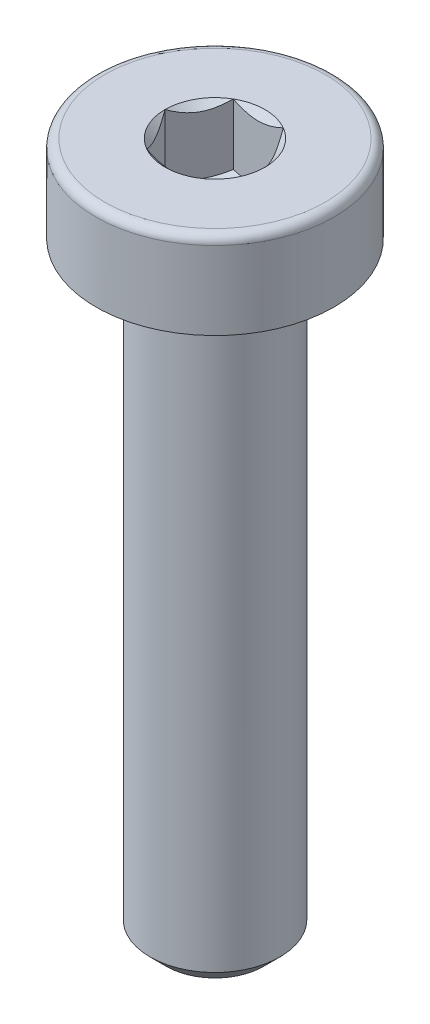
ISO-10303-21;
HEADER;
FILE_DESCRIPTION(('STEP AP214'),'2;1');
FILE_NAME('part.step','',(''),(''),'','','');
FILE_SCHEMA(('AUTOMOTIVE_DESIGN { 1 0 10303 214 1 1 1 1 }'));
ENDSEC;
DATA;
#1=APPLICATION_CONTEXT('core data for automotive mechanical design processes');
#2=APPLICATION_PROTOCOL_DEFINITION('international standard','automotive_design',2000,#1);
#3=PRODUCT_CONTEXT('',#1,'mechanical');
#4=PRODUCT('Part','Part','',(#3));
#5=PRODUCT_RELATED_PRODUCT_CATEGORY('part','',(#4));
#6=PRODUCT_DEFINITION_FORMATION('','',#4);
#7=PRODUCT_DEFINITION_CONTEXT('part definition',#1,'design');
#8=PRODUCT_DEFINITION('design','',#6,#7);
#9=PRODUCT_DEFINITION_SHAPE('','',#8);
#10=(LENGTH_UNIT() NAMED_UNIT(*) SI_UNIT(.MILLI.,.METRE.));
#11=(NAMED_UNIT(*) PLANE_ANGLE_UNIT() SI_UNIT($,.RADIAN.));
#12=(NAMED_UNIT(*) SI_UNIT($,.STERADIAN.) SOLID_ANGLE_UNIT());
#13=UNCERTAINTY_MEASURE_WITH_UNIT(LENGTH_MEASURE(1.E-05),#10,'distance_accuracy_value','');
#14=(GEOMETRIC_REPRESENTATION_CONTEXT(3) GLOBAL_UNCERTAINTY_ASSIGNED_CONTEXT((#13)) GLOBAL_UNIT_ASSIGNED_CONTEXT((#10,
#11,#12)) REPRESENTATION_CONTEXT('',''));
#15=CARTESIAN_POINT('',(0.,0.,0.));
#16=DIRECTION('',(0.,0.,1.));
#17=DIRECTION('',(1.,0.,0.));
#18=AXIS2_PLACEMENT_3D('',#15,#16,#17);
#19=CARTESIAN_POINT('',(0.,-0.2,0.));
#20=DIRECTION('',(0.,1.,0.));
#21=DIRECTION('',(0.,0.,1.));
#22=AXIS2_PLACEMENT_3D('',#19,#20,#21);
#23=TOROIDAL_SURFACE('',#22,1.7,0.2);
#24=CARTESIAN_POINT('',(0.,0.,0.));
#25=DIRECTION('',(0.,1.,0.));
#26=DIRECTION('',(0.,0.,1.));
#27=AXIS2_PLACEMENT_3D('',#24,#25,#26);
#28=CIRCLE('',#27,1.7);
#29=CARTESIAN_POINT('',(0.,0.,1.7));
#30=VERTEX_POINT('',#29);
#31=EDGE_CURVE('E123',#30,#30,#28,.T.);
#32=ORIENTED_EDGE('',*,*,#31,.F.);
#33=EDGE_LOOP('',(#32));
#34=FACE_BOUND('',#33,.T.);
#35=CARTESIAN_POINT('',(0.,-0.2,0.));
#36=DIRECTION('',(0.,-1.,0.));
#37=DIRECTION('',(0.,0.,1.));
#38=AXIS2_PLACEMENT_3D('',#35,#36,#37);
#39=CIRCLE('',#38,1.5);
#40=CARTESIAN_POINT('',(0.,-0.2,1.5));
#41=VERTEX_POINT('',#40);
#42=EDGE_CURVE('E367',#41,#41,#39,.T.);
#43=ORIENTED_EDGE('',*,*,#42,.F.);
#44=EDGE_LOOP('',(#43));
#45=FACE_BOUND('',#44,.T.);
#46=ADVANCED_FACE('F16',(#34,#45),#23,.F.);
#47=CARTESIAN_POINT('',(0.,-14.,0.));
#48=DIRECTION('',(0.,1.,0.));
#49=DIRECTION('',(1.,0.,0.));
#50=AXIS2_PLACEMENT_3D('',#47,#48,#49);
#51=PLANE('',#50);
#52=CARTESIAN_POINT('',(0.,-14.,0.));
#53=DIRECTION('',(0.,-1.,0.));
#54=DIRECTION('',(0.,0.,1.));
#55=AXIS2_PLACEMENT_3D('',#52,#53,#54);
#56=CIRCLE('',#55,1.125);
#57=CARTESIAN_POINT('',(0.,-14.,1.125));
#58=VERTEX_POINT('',#57);
#59=EDGE_CURVE('E10',#58,#58,#56,.T.);
#60=ORIENTED_EDGE('',*,*,#59,.T.);
#61=EDGE_LOOP('',(#60));
#62=FACE_BOUND('',#61,.T.);
#63=ADVANCED_FACE('F191',(#62),#51,.F.);
#64=CARTESIAN_POINT('',(0.,-14.125,0.));
#65=DIRECTION('',(0.,1.,0.));
#66=DIRECTION('',(-1.,0.,0.));
#67=AXIS2_PLACEMENT_3D('',#64,#65,#66);
#68=CONICAL_SURFACE('',#67,1.,0.785398163397448);
#69=ORIENTED_EDGE('',*,*,#59,.F.);
#70=EDGE_LOOP('',(#69));
#71=FACE_BOUND('',#70,.T.);
#72=CARTESIAN_POINT('',(0.,-13.625,0.));
#73=DIRECTION('',(0.,-1.,0.));
#74=DIRECTION('',(-1.,0.,0.));
#75=AXIS2_PLACEMENT_3D('',#72,#73,#74);
#76=CIRCLE('',#75,1.5);
#77=CARTESIAN_POINT('',(-1.5,-13.625,0.));
#78=VERTEX_POINT('',#77);
#79=EDGE_CURVE('E360',#78,#78,#76,.T.);
#80=ORIENTED_EDGE('',*,*,#79,.T.);
#81=EDGE_LOOP('',(#80));
#82=FACE_BOUND('',#81,.T.);
#83=ADVANCED_FACE('F197',(#71,#82),#68,.T.);
#84=CARTESIAN_POINT('',(-1.15470053837925,0.5,0.));
#85=DIRECTION('',(-0.866025403784439,0.,0.5));
#86=DIRECTION('',(0.,1.,0.));
#87=AXIS2_PLACEMENT_3D('',#84,#85,#86);
#88=PLANE('',#87);
#89=CARTESIAN_POINT('',(-1.15470053837925,2.,0.));
#90=CARTESIAN_POINT('',(-1.00117078125086,1.84647024287162,0.265921339820074));
#91=CARTESIAN_POINT('',(-0.867089249093141,1.84530172515184,0.498157365873931));
#92=CARTESIAN_POINT('',(-0.733215253083504,1.8441350161052,0.730033928774895));
#93=CARTESIAN_POINT('',(-0.57735026918948,1.99999999999927,1.00000000000025));
#94=B_SPLINE_CURVE_WITH_KNOTS('',2,(#89,#90,#91,#92,#93),.UNSPECIFIED.,.F.,.F.,(3,2,3),(0.,0.5,
1.),.UNSPECIFIED.);
#95=CARTESIAN_POINT('',(-1.15470053837925,2.,0.));
#96=VERTEX_POINT('',#95);
#97=CARTESIAN_POINT('',(-0.577350269189626,2.,1.));
#98=VERTEX_POINT('',#97);
#99=EDGE_CURVE('E114',#96,#98,#94,.T.);
#100=ORIENTED_EDGE('',*,*,#99,.T.);
#101=DIRECTION('',(0.,1.,0.));
#102=VECTOR('',#101,1.);
#103=CARTESIAN_POINT('',(-0.577350269189626,0.5,1.));
#104=LINE('',#103,#102);
#105=CARTESIAN_POINT('',(-0.577350269189626,0.589316397477042,1.));
#106=VERTEX_POINT('',#105);
#107=EDGE_CURVE('E97',#106,#98,#104,.T.);
#108=ORIENTED_EDGE('',*,*,#107,.F.);
#109=CARTESIAN_POINT('',(-1.15470053837925,0.589316397477043,0.));
#110=CARTESIAN_POINT('',(-1.1422776254852,0.582145061548454,0.021515887063845));
#111=CARTESIAN_POINT('',(-1.12980572440145,0.575290529962869,0.0431130815008311));
#112=CARTESIAN_POINT('',(-1.10516877386456,0.562518070323557,0.0858404042081745));
#113=CARTESIAN_POINT('',(-1.09300571707735,0.556578244850613,0.106965156736799));
#114=CARTESIAN_POINT('',(-1.06894241920652,0.545632531934319,0.148883907199831));
#115=CARTESIAN_POINT('',(-1.05704304561731,0.540607317583832,0.169673316642415));
#116=CARTESIAN_POINT('',(-1.03344126715609,0.531488117613305,0.211063578718422));
#117=CARTESIAN_POINT('',(-1.02173909837023,0.527379242171332,0.231661269176965));
#118=CARTESIAN_POINT('',(-0.998439619296902,0.520087570224119,0.272815704232481));
#119=CARTESIAN_POINT('',(-0.986842367431211,0.516896357949622,0.293370983478975));
#120=CARTESIAN_POINT('',(-0.963630649649038,0.511432897740972,0.33458880079611));
#121=CARTESIAN_POINT('',(-0.952016187375457,0.509160477291832,0.355251317992815));
#122=CARTESIAN_POINT('',(-0.928615137972573,0.505525933544308,0.396828053797181));
#123=CARTESIAN_POINT('',(-0.916827980653532,0.504172969622274,0.41774275139525));
#124=CARTESIAN_POINT('',(-0.892891053471395,0.502367479696766,0.459958305071784));
#125=CARTESIAN_POINT('',(-0.88073874884194,0.501933526563364,0.481258507610898));
#126=CARTESIAN_POINT('',(-0.856257235695783,0.501957698326459,0.523654214585648));
#127=CARTESIAN_POINT('',(-0.843928822248721,0.502412614939665,0.544750180023796));
#128=CARTESIAN_POINT('',(-0.819420681665752,0.504253995001974,0.586439287846091));
#129=CARTESIAN_POINT('',(-0.80724270276635,0.505622235893781,0.607034252182705));
#130=CARTESIAN_POINT('',(-0.783017066755103,0.509280885955065,0.647952632793485));
#131=CARTESIAN_POINT('',(-0.770969274303699,0.511562376898162,0.668276765739735));
#132=CARTESIAN_POINT('',(-0.746956492541301,0.51703779791969,0.708859066345339));
#133=CARTESIAN_POINT('',(-0.734991529583474,0.520232005852064,0.729117212014218));
#134=CARTESIAN_POINT('',(-0.711075209617807,0.527523596594688,0.769746807127452));
#135=CARTESIAN_POINT('',(-0.699125090769733,0.531629372272877,0.790117471798635));
#136=CARTESIAN_POINT('',(-0.675154824355723,0.540736433878131,0.831125976310756));
#137=CARTESIAN_POINT('',(-0.663137276162293,0.545752483880906,0.851762040669467));
#138=CARTESIAN_POINT('',(-0.638941132936142,0.556674024791821,0.893430606128303));
#139=CARTESIAN_POINT('',(-0.626766044340648,0.562598648059455,0.914460089337463));
#140=CARTESIAN_POINT('',(-0.602159683115032,0.575334898103387,0.957023431622116));
#141=CARTESIAN_POINT('',(-0.58973203881774,0.582168191432241,0.978552925679333));
#142=CARTESIAN_POINT('',(-0.57735026918962,0.589316397477036,0.999999999999998));
#143=B_SPLINE_CURVE_WITH_KNOTS('',3,(#109,#110,#111,#112,#113,#114,#115,#116,#117,#118,#119,
#120,#121,#122,#123,#124,#125,#126,#127,#128,#129,#130,#131,#132,#133,#134,#135,#136,#137,#138,
#139,#140,#141,#142),.UNSPECIFIED.,.F.,.F.,(4,2,2,2,2,2,2,2,2,2,2,2,2,2,2,2,4),(0.,
0.0775799336285172,0.15283713344211,0.226249266739255,0.298363815314992,0.369794224205565,
0.441211214882481,0.51332960442225,0.586892093802747,0.66018955743096,0.732066645944519,
0.803258313913417,0.8744716775434,0.946370107950428,1.01956032219192,1.09458388807375,
1.17191346643988),.UNSPECIFIED.);
#144=CARTESIAN_POINT('',(-1.15470053837925,0.589316397477044,0.));
#145=VERTEX_POINT('',#144);
#146=EDGE_CURVE('E248',#145,#106,#143,.T.);
#147=ORIENTED_EDGE('',*,*,#146,.F.);
#148=DIRECTION('',(0.,1.,0.));
#149=VECTOR('',#148,1.);
#150=CARTESIAN_POINT('',(-1.15470053837925,0.5,0.));
#151=LINE('',#150,#149);
#152=EDGE_CURVE('E29',#145,#96,#151,.T.);
#153=ORIENTED_EDGE('',*,*,#152,.T.);
#154=EDGE_LOOP('',(#100,#108,#147,#153));
#155=FACE_BOUND('',#154,.T.);
#156=ADVANCED_FACE('F117',(#155),#88,.F.);
#157=CARTESIAN_POINT('',(-0.577350269189624,0.5,-1.));
#158=DIRECTION('',(-0.866025403784438,0.,-0.5));
#159=DIRECTION('',(-0.5,0.,0.866025403784438));
#160=AXIS2_PLACEMENT_3D('',#157,#158,#159);
#161=PLANE('',#160);
#162=CARTESIAN_POINT('',(-0.577350269189625,2.,-0.999999999999998));
#163=CARTESIAN_POINT('',(-0.730880026318,1.84647024287162,-0.734078660179944));
#164=CARTESIAN_POINT('',(-0.864961558475733,1.84530172515184,-0.501842634126069));
#165=CARTESIAN_POINT('',(-0.998835554485382,1.8441350161052,-0.269966071225084));
#166=CARTESIAN_POINT('',(-1.15470053837939,1.99999999999928,2.43945488809238E-13));
#167=B_SPLINE_CURVE_WITH_KNOTS('',2,(#162,#163,#164,#165,#166),.UNSPECIFIED.,.F.,.F.,(3,2,3),
(0.,0.5,1.),.UNSPECIFIED.);
#168=CARTESIAN_POINT('',(-0.577350269189625,2.,-1.));
#169=VERTEX_POINT('',#168);
#170=EDGE_CURVE('E291',#169,#96,#167,.T.);
#171=ORIENTED_EDGE('',*,*,#170,.T.);
#172=ORIENTED_EDGE('',*,*,#152,.F.);
#173=CARTESIAN_POINT('',(-0.577350269189627,0.589316397477045,-1.));
#174=CARTESIAN_POINT('',(-0.589772117524805,0.582145061548479,-0.978483498312897));
#175=CARTESIAN_POINT('',(-0.602239886015797,0.575290529962917,-0.956883917922458));
#176=CARTESIAN_POINT('',(-0.626924357647565,0.562518070323645,-0.914184031532187));
#177=CARTESIAN_POINT('',(-0.639137401592391,0.556578244850719,-0.893088139102523));
#178=CARTESIAN_POINT('',(-0.663408455452852,0.54563253193445,-0.851289336616123));
#179=CARTESIAN_POINT('',(-0.675462925365203,0.540607317583974,-0.830589472077488));
#180=CARTESIAN_POINT('',(-0.699507054561722,0.53148811761346,-0.789454601317619));
#181=CARTESIAN_POINT('',(-0.711494093365185,0.527379242171491,-0.769021380640425));
#182=CARTESIAN_POINT('',(-0.735485140065021,0.520087570224278,-0.728266222340228));
#183=CARTESIAN_POINT('',(-0.747487908141538,0.516896357949778,-0.707945067987197));
#184=CARTESIAN_POINT('',(-0.771577726135665,0.511432897741115,-0.667234222063753));
#185=CARTESIAN_POINT('',(-0.783664759797369,0.509160477291966,-0.646844544085154));
#186=CARTESIAN_POINT('',(-0.807970744508966,0.505525933544416,-0.605790272924778));
#187=CARTESIAN_POINT('',(-0.820189825281854,0.504172969622366,-0.585124946448999));
#188=CARTESIAN_POINT('',(-0.844781103609498,0.502367479696817,-0.54328718258234));
#189=CARTESIAN_POINT('',(-0.857151467799394,0.501933526563389,-0.522112876789074));
#190=CARTESIAN_POINT('',(-0.881626470477781,0.501957698326439,-0.479713410994005));
#191=CARTESIAN_POINT('',(-0.89373190574098,0.50241261493962,-0.458488709041452));
#192=CARTESIAN_POINT('',(-0.917581661884609,0.504253995001887,-0.416419482786004));
#193=CARTESIAN_POINT('',(-0.929328434740412,0.505622235893679,-0.395575561524098));
#194=CARTESIAN_POINT('',(-0.952651973825387,0.509280885954937,-0.354136355010195));
#195=CARTESIAN_POINT('',(-0.964229293041011,0.511562376898024,-0.333540594214658));
#196=CARTESIAN_POINT('',(-0.987368205428263,0.517037797919539,-0.292453764890132));
#197=CARTESIAN_POINT('',(-0.998929792732163,0.52023200585191,-0.271962730178892));
#198=CARTESIAN_POINT('',(-1.02215789426288,0.527523596594534,-0.230935791966992));
#199=CARTESIAN_POINT('',(-1.03382434793608,0.531629372272727,-0.210401353130728));
#200=CARTESIAN_POINT('',(-1.05735362140782,0.540736433877994,-0.169138241224641));
#201=CARTESIAN_POINT('',(-1.06921620327991,0.54575248388078,-0.148412707018555));
#202=CARTESIAN_POINT('',(-1.09320416789351,0.55667402479172,-0.106623949581629));
#203=CARTESIAN_POINT('',(-1.10532869028339,0.562598648059372,-0.0855652719599876));
#204=CARTESIAN_POINT('',(-1.12988644535915,0.575334898103344,-0.0429738669014798));
#205=CARTESIAN_POINT('',(-1.14231771199472,0.58216819143222,-0.0214464642021553));
#206=CARTESIAN_POINT('',(-1.15470053837925,0.589316397477038,0.));
#207=B_SPLINE_CURVE_WITH_KNOTS('',3,(#173,#174,#175,#176,#177,#178,#179,#180,#181,#182,#183,
#184,#185,#186,#187,#188,#189,#190,#191,#192,#193,#194,#195,#196,#197,#198,#199,#200,#201,#202,
#203,#204,#205,#206),.UNSPECIFIED.,.F.,.F.,(4,2,2,2,2,2,2,2,2,2,2,2,2,2,2,2,4),(0.,
0.0775799336282744,0.152837133441706,0.226249266738765,0.298363815314486,0.369794224205106,
0.441211214882123,0.513329604422042,0.586892093802727,0.660189557430751,0.73206664594416,
0.803258313912957,0.874471677542892,0.946370107949937,1.01956032219152,1.09458388807351,
1.17191346643989),.UNSPECIFIED.);
#208=CARTESIAN_POINT('',(-0.577350269189625,0.589316397477047,-1.));
#209=VERTEX_POINT('',#208);
#210=EDGE_CURVE('E357',#209,#145,#207,.T.);
#211=ORIENTED_EDGE('',*,*,#210,.F.);
#212=DIRECTION('',(0.,1.,0.));
#213=VECTOR('',#212,1.);
#214=CARTESIAN_POINT('',(-0.577350269189625,0.5,-1.));
#215=LINE('',#214,#213);
#216=EDGE_CURVE('E282',#209,#169,#215,.T.);
#217=ORIENTED_EDGE('',*,*,#216,.T.);
#218=EDGE_LOOP('',(#171,#172,#211,#217));
#219=FACE_BOUND('',#218,.T.);
#220=ADVANCED_FACE('F261',(#219),#161,.F.);
#221=CARTESIAN_POINT('',(0.577350269189628,0.5,-1.));
#222=DIRECTION('',(0.,0.,-1.));
#223=DIRECTION('',(0.,-1.,0.));
#224=AXIS2_PLACEMENT_3D('',#221,#222,#223);
#225=PLANE('',#224);
#226=CARTESIAN_POINT('',(0.577350269189625,2.,-1.));
#227=CARTESIAN_POINT('',(0.270060534721078,1.84635513276574,-1.));
#228=CARTESIAN_POINT('',(0.000495609398556127,1.84529958443508,-1.));
#229=CARTESIAN_POINT('',(-0.265863448139593,1.84425658947496,-1.));
#230=CARTESIAN_POINT('',(-0.577350269189632,2.,-1.));
#231=B_SPLINE_CURVE_WITH_KNOTS('',2,(#226,#227,#228,#229,#230),.UNSPECIFIED.,.F.,.F.,(3,2,3),
(0.,0.5,1.),.UNSPECIFIED.);
#232=CARTESIAN_POINT('',(0.577350269189628,2.,-1.));
#233=VERTEX_POINT('',#232);
#234=EDGE_CURVE('E416',#233,#169,#231,.T.);
#235=ORIENTED_EDGE('',*,*,#234,.T.);
#236=ORIENTED_EDGE('',*,*,#216,.F.);
#237=CARTESIAN_POINT('',(0.577350269189629,0.589316397477046,-1.));
#238=CARTESIAN_POINT('',(0.552505507960357,0.582145061548458,-0.999999385376672));
#239=CARTESIAN_POINT('',(0.527565838385578,0.575290529962872,-0.999996999423149));
#240=CARTESIAN_POINT('',(0.47824441621688,0.56251807032356,-1.0000244357401));
#241=CARTESIAN_POINT('',(0.453868315484823,0.556578244850616,-1.00005329583901));
#242=CARTESIAN_POINT('',(0.405533963753522,0.545632531934322,-1.00017324381556));
#243=CARTESIAN_POINT('',(0.381580120251964,0.540607317583835,-1.00026278871947));
#244=CARTESIAN_POINT('',(0.333934212594235,0.531488117613308,-1.00051818003557));
#245=CARTESIAN_POINT('',(0.310245005004916,0.527379242171335,-1.00068264981691));
#246=CARTESIAN_POINT('',(0.262954479231781,0.520087570224122,-1.00108192657222));
#247=CARTESIAN_POINT('',(0.239354459289589,0.516896357949625,-1.00131605146569));
#248=CARTESIAN_POINT('',(0.192052923513318,0.511432897740975,-1.00182302285942));
#249=CARTESIAN_POINT('',(0.168351427578049,0.509160477291835,-1.00209586207756));
#250=CARTESIAN_POINT('',(0.120644393463594,0.505525933544311,-1.00261832672163));
#251=CARTESIAN_POINT('',(0.0966381553716762,0.504172969622278,-1.00286769784397));
#252=CARTESIAN_POINT('',(0.0481099498619062,0.50236747969677,-1.00324548765397));
#253=CARTESIAN_POINT('',(0.023587281042553,0.501933526563368,-1.00337138439989));
#254=CARTESIAN_POINT('',(-0.0253692347820597,0.501957698326463,-1.00336762557961));
#255=CARTESIAN_POINT('',(-0.0498030834923871,0.502412614939669,-1.00323888906517));
#256=CARTESIAN_POINT('',(-0.0981609802190884,0.504253995001978,-1.00285877063195));
#257=CARTESIAN_POINT('',(-0.122085731974333,0.505622235893786,-1.00260981370662));
#258=CARTESIAN_POINT('',(-0.169634907070614,0.509280885955069,-1.00208898780344));
#259=CARTESIAN_POINT('',(-0.193260018737662,0.511562376898166,-1.00181735995412));
#260=CARTESIAN_POINT('',(-0.240411712887332,0.517037797919695,-1.00131283123516));
#261=CARTESIAN_POINT('',(-0.26393826314906,0.520232005852068,-1.00107994219278));
#262=CARTESIAN_POINT('',(-0.31108268464543,0.527523596594693,-1.00068259909409));
#263=CARTESIAN_POINT('',(-0.334699257166686,0.531629372272882,-1.00051882492901));
#264=CARTESIAN_POINT('',(-0.382198797052396,0.540736433878136,-1.00026421753506));
#265=CARTESIAN_POINT('',(-0.406078927117886,0.545752483880911,-1.0001747476877));
#266=CARTESIAN_POINT('',(-0.454263034957568,0.556674024791826,-1.00005455570966));
#267=CARTESIAN_POINT('',(-0.478562645942905,0.56259864805946,-1.00002536129722));
#268=CARTESIAN_POINT('',(-0.527726762244194,0.575334898103392,-0.999997298523466));
#269=CARTESIAN_POINT('',(-0.552585673177015,0.582168191432246,-0.999999389881423));
#270=CARTESIAN_POINT('',(-0.577350269189624,0.589316397477041,-0.999999999999998));
#271=B_SPLINE_CURVE_WITH_KNOTS('',3,(#237,#238,#239,#240,#241,#242,#243,#244,#245,#246,#247,
#248,#249,#250,#251,#252,#253,#254,#255,#256,#257,#258,#259,#260,#261,#262,#263,#264,#265,#266,
#267,#268,#269,#270),.UNSPECIFIED.,.F.,.F.,(4,2,2,2,2,2,2,2,2,2,2,2,2,2,2,2,4),(0.,
0.0775799336285192,0.152837133442114,0.22624926673926,0.298363815314997,0.369794224205569,
0.441211214882483,0.513329604422249,0.586892093802744,0.660189557430959,0.732066645944521,
0.803258313913422,0.874471677543404,0.946370107950433,1.01956032219193,1.09458388807376,
1.17191346643988),.UNSPECIFIED.);
#272=CARTESIAN_POINT('',(0.577350269189628,0.589316397477047,-1.));
#273=VERTEX_POINT('',#272);
#274=EDGE_CURVE('E151',#273,#209,#271,.T.);
#275=ORIENTED_EDGE('',*,*,#274,.F.);
#276=DIRECTION('',(0.,1.,0.));
#277=VECTOR('',#276,1.);
#278=CARTESIAN_POINT('',(0.577350269189628,0.5,-1.));
#279=LINE('',#278,#277);
#280=EDGE_CURVE('E418',#273,#233,#279,.T.);
#281=ORIENTED_EDGE('',*,*,#280,.T.);
#282=EDGE_LOOP('',(#235,#236,#275,#281));
#283=FACE_BOUND('',#282,.T.);
#284=ADVANCED_FACE('F315',(#283),#225,.F.);
#285=CARTESIAN_POINT('',(1.15470053837925,0.5,0.));
#286=DIRECTION('',(0.866025403784439,0.,-0.5));
#287=DIRECTION('',(0.,-1.,0.));
#288=AXIS2_PLACEMENT_3D('',#285,#286,#287);
#289=PLANE('',#288);
#290=CARTESIAN_POINT('',(1.15470053837925,2.,0.));
#291=CARTESIAN_POINT('',(1.00117078125086,1.84647024287162,-0.265921339820078));
#292=CARTESIAN_POINT('',(0.867089249093142,1.84530172515184,-0.498157365873931));
#293=CARTESIAN_POINT('',(0.733215253083495,1.84413501610522,-0.730033928774914));
#294=CARTESIAN_POINT('',(0.577350269189482,1.99999999999929,-1.00000000000025));
#295=B_SPLINE_CURVE_WITH_KNOTS('',2,(#290,#291,#292,#293,#294),.UNSPECIFIED.,.F.,.F.,(3,2,3),
(0.,0.5,1.),.UNSPECIFIED.);
#296=CARTESIAN_POINT('',(1.15470053837925,2.,0.));
#297=VERTEX_POINT('',#296);
#298=EDGE_CURVE('E443',#297,#233,#295,.T.);
#299=ORIENTED_EDGE('',*,*,#298,.T.);
#300=ORIENTED_EDGE('',*,*,#280,.F.);
#301=CARTESIAN_POINT('',(1.15470053837925,0.589316397477043,0.));
#302=CARTESIAN_POINT('',(1.1422776254852,0.582145061548455,-0.0215158870638419));
#303=CARTESIAN_POINT('',(1.12980572440145,0.575290529962869,-0.0431130815008281));
#304=CARTESIAN_POINT('',(1.10516877386457,0.562518070323558,-0.0858404042081722));
#305=CARTESIAN_POINT('',(1.09300571707735,0.556578244850615,-0.106965156736797));
#306=CARTESIAN_POINT('',(1.06894241920652,0.545632531934321,-0.148883907199829));
#307=CARTESIAN_POINT('',(1.05704304561732,0.540607317583834,-0.169673316642413));
#308=CARTESIAN_POINT('',(1.03344126715609,0.531488117613307,-0.211063578718421));
#309=CARTESIAN_POINT('',(1.02173909837023,0.527379242171335,-0.231661269176964));
#310=CARTESIAN_POINT('',(0.998439619296906,0.520087570224122,-0.272815704232479));
#311=CARTESIAN_POINT('',(0.986842367431215,0.516896357949625,-0.293370983478973));
#312=CARTESIAN_POINT('',(0.963630649649042,0.511432897740975,-0.334588800796107));
#313=CARTESIAN_POINT('',(0.952016187375462,0.509160477291835,-0.355251317992812));
#314=CARTESIAN_POINT('',(0.928615137972578,0.505525933544311,-0.396828053797177));
#315=CARTESIAN_POINT('',(0.916827980653537,0.504172969622278,-0.417742751395246));
#316=CARTESIAN_POINT('',(0.892891053471401,0.50236747969677,-0.459958305071779));
#317=CARTESIAN_POINT('',(0.880738748841946,0.501933526563367,-0.481258507610893));
#318=CARTESIAN_POINT('',(0.856257235695789,0.501957698326462,-0.523654214585642));
#319=CARTESIAN_POINT('',(0.843928822248727,0.502412614939669,-0.54475018002379));
#320=CARTESIAN_POINT('',(0.819420681665758,0.504253995001977,-0.586439287846085));
#321=CARTESIAN_POINT('',(0.807242702766356,0.505622235893785,-0.6070342521827));
#322=CARTESIAN_POINT('',(0.783017066755108,0.509280885955068,-0.64795263279348));
#323=CARTESIAN_POINT('',(0.770969274303704,0.511562376898166,-0.66827676573973));
#324=CARTESIAN_POINT('',(0.746956492541306,0.517037797919694,-0.708859066345335));
#325=CARTESIAN_POINT('',(0.734991529583479,0.520232005852067,-0.729117212014214));
#326=CARTESIAN_POINT('',(0.711075209617813,0.527523596594692,-0.769746807127448));
#327=CARTESIAN_POINT('',(0.699125090769738,0.531629372272881,-0.790117471798631));
#328=CARTESIAN_POINT('',(0.675154824355728,0.540736433878135,-0.831125976310752));
#329=CARTESIAN_POINT('',(0.663137276162299,0.545752483880911,-0.851762040669464));
#330=CARTESIAN_POINT('',(0.638941132936147,0.556674024791825,-0.8934306061283));
#331=CARTESIAN_POINT('',(0.626766044340653,0.562598648059459,-0.91446008933746));
#332=CARTESIAN_POINT('',(0.602159683115038,0.575334898103392,-0.957023431622114));
#333=CARTESIAN_POINT('',(0.589732038817745,0.582168191432245,-0.978552925679331));
#334=CARTESIAN_POINT('',(0.577350269189625,0.589316397477041,-0.999999999999997));
#335=B_SPLINE_CURVE_WITH_KNOTS('',3,(#301,#302,#303,#304,#305,#306,#307,#308,#309,#310,#311,
#312,#313,#314,#315,#316,#317,#318,#319,#320,#321,#322,#323,#324,#325,#326,#327,#328,#329,#330,
#331,#332,#333,#334),.UNSPECIFIED.,.F.,.F.,(4,2,2,2,2,2,2,2,2,2,2,2,2,2,2,2,4),(0.,
0.0775799336285166,0.15283713344211,0.226249266739254,0.298363815314991,0.369794224205563,
0.441211214882478,0.513329604422245,0.586892093802741,0.660189557430954,0.732066645944514,
0.803258313913414,0.874471677543396,0.946370107950424,1.01956032219192,1.09458388807375,
1.17191346643988),.UNSPECIFIED.);
#336=CARTESIAN_POINT('',(1.15470053837925,0.589316397477045,0.));
#337=VERTEX_POINT('',#336);
#338=EDGE_CURVE('E346',#337,#273,#335,.T.);
#339=ORIENTED_EDGE('',*,*,#338,.F.);
#340=DIRECTION('',(0.,1.,0.));
#341=VECTOR('',#340,1.);
#342=CARTESIAN_POINT('',(1.15470053837925,0.5,0.));
#343=LINE('',#342,#341);
#344=EDGE_CURVE('E110',#337,#297,#343,.T.);
#345=ORIENTED_EDGE('',*,*,#344,.T.);
#346=EDGE_LOOP('',(#299,#300,#339,#345));
#347=FACE_BOUND('',#346,.T.);
#348=ADVANCED_FACE('F319',(#347),#289,.F.);
#349=CARTESIAN_POINT('',(0.577350269189626,0.5,1.));
#350=DIRECTION('',(0.866025403784439,0.,0.5));
#351=DIRECTION('',(0.,-1.,0.));
#352=AXIS2_PLACEMENT_3D('',#349,#350,#351);
#353=PLANE('',#352);
#354=CARTESIAN_POINT('',(0.577350269189625,2.,1.));
#355=CARTESIAN_POINT('',(0.730880026318006,1.84647024287162,0.734078660179936));
#356=CARTESIAN_POINT('',(0.864961558475735,1.84530172515183,0.501842634126069));
#357=CARTESIAN_POINT('',(0.998835554485375,1.8441350161052,0.269966071225099));
#358=CARTESIAN_POINT('',(1.1547005383794,1.99999999999928,-2.51968584885631E-13));
#359=B_SPLINE_CURVE_WITH_KNOTS('',2,(#354,#355,#356,#357,#358),.UNSPECIFIED.,.F.,.F.,(3,2,3),
(0.,0.5,1.),.UNSPECIFIED.);
#360=CARTESIAN_POINT('',(0.577350269189626,2.,1.));
#361=VERTEX_POINT('',#360);
#362=EDGE_CURVE('E146',#361,#297,#359,.T.);
#363=ORIENTED_EDGE('',*,*,#362,.T.);
#364=ORIENTED_EDGE('',*,*,#344,.F.);
#365=CARTESIAN_POINT('',(0.577350269189629,0.589316397477041,1.));
#366=CARTESIAN_POINT('',(0.589772117524845,0.582145061548453,0.97848349831283));
#367=CARTESIAN_POINT('',(0.602239886015871,0.575290529962867,0.95688391792232));
#368=CARTESIAN_POINT('',(0.626924357647685,0.562518070323555,0.914184031531926));
#369=CARTESIAN_POINT('',(0.639137401592525,0.556578244850612,0.893088139102211));
#370=CARTESIAN_POINT('',(0.663408455452999,0.545632531934318,0.851289336615727));
#371=CARTESIAN_POINT('',(0.675462925365349,0.540607317583831,0.83058947207706));
#372=CARTESIAN_POINT('',(0.699507054561857,0.531488117613304,0.789454601317146));
#373=CARTESIAN_POINT('',(0.71149409336531,0.527379242171332,0.769021380639941));
#374=CARTESIAN_POINT('',(0.735485140065122,0.520087570224119,0.728266222339741));
#375=CARTESIAN_POINT('',(0.747487908141624,0.516896357949621,0.70794506798672));
#376=CARTESIAN_POINT('',(0.771577726135722,0.511432897740971,0.667234222063315));
#377=CARTESIAN_POINT('',(0.783664759797411,0.509160477291832,0.646844544084746));
#378=CARTESIAN_POINT('',(0.807970744508983,0.505525933544308,0.605790272924451));
#379=CARTESIAN_POINT('',(0.82018982528186,0.504172969622274,0.585124946448723));
#380=CARTESIAN_POINT('',(0.844781103609495,0.502367479696766,0.543287182582189));
#381=CARTESIAN_POINT('',(0.857151467799393,0.501933526563364,0.522112876788997));
#382=CARTESIAN_POINT('',(0.881626470477849,0.501957698326459,0.479713410993967));
#383=CARTESIAN_POINT('',(0.893731905741113,0.502412614939665,0.458488709041379));
#384=CARTESIAN_POINT('',(0.917581661884845,0.504253995001974,0.41641948278586));
#385=CARTESIAN_POINT('',(0.929328434740686,0.505622235893782,0.395575561523919));
#386=CARTESIAN_POINT('',(0.952651973825719,0.509280885955065,0.354136355009953));
#387=CARTESIAN_POINT('',(0.964229293041362,0.511562376898163,0.333540594214389));
#388=CARTESIAN_POINT('',(0.987368205428633,0.517037797919691,0.292453764889818));
#389=CARTESIAN_POINT('',(0.998929792732534,0.520232005852065,0.27196273017856));
#390=CARTESIAN_POINT('',(1.02215789426324,0.527523596594689,0.230935791966639));
#391=CARTESIAN_POINT('',(1.03382434793642,0.531629372272878,0.210401353130372));
#392=CARTESIAN_POINT('',(1.05735362140812,0.540736433878132,0.169138241224298));
#393=CARTESIAN_POINT('',(1.06921620328018,0.545752483880908,0.148412707018228));
#394=CARTESIAN_POINT('',(1.09320416789371,0.556674024791822,0.106623949581356));
#395=CARTESIAN_POINT('',(1.10532869028355,0.562598648059457,0.0855652719597518));
#396=CARTESIAN_POINT('',(1.12988644535923,0.575334898103389,0.0429738669013457));
#397=CARTESIAN_POINT('',(1.14231771199476,0.582168191432243,0.0214464642020851));
#398=CARTESIAN_POINT('',(1.15470053837925,0.589316397477038,0.));
#399=B_SPLINE_CURVE_WITH_KNOTS('',3,(#365,#366,#367,#368,#369,#370,#371,#372,#373,#374,#375,
#376,#377,#378,#379,#380,#381,#382,#383,#384,#385,#386,#387,#388,#389,#390,#391,#392,#393,#394,
#395,#396,#397,#398),.UNSPECIFIED.,.F.,.F.,(4,2,2,2,2,2,2,2,2,2,2,2,2,2,2,2,4),(0.,
0.077579933628518,0.152837133442112,0.226249266739257,0.298363815314994,0.369794224205567,
0.441211214882482,0.51332960442225,0.586892093802747,0.66018955743096,0.73206664594452,
0.803258313913421,0.874471677543402,0.946370107950432,1.01956032219193,1.09458388807376,
1.17191346643989),.UNSPECIFIED.);
#400=CARTESIAN_POINT('',(0.577350269189626,0.589316397477042,1.));
#401=VERTEX_POINT('',#400);
#402=EDGE_CURVE('E345',#401,#337,#399,.T.);
#403=ORIENTED_EDGE('',*,*,#402,.F.);
#404=DIRECTION('',(0.,1.,0.));
#405=VECTOR('',#404,1.);
#406=CARTESIAN_POINT('',(0.577350269189626,0.5,1.));
#407=LINE('',#406,#405);
#408=EDGE_CURVE('E111',#401,#361,#407,.T.);
#409=ORIENTED_EDGE('',*,*,#408,.T.);
#410=EDGE_LOOP('',(#363,#364,#403,#409));
#411=FACE_BOUND('',#410,.T.);
#412=ADVANCED_FACE('F324',(#411),#353,.F.);
#413=CARTESIAN_POINT('',(-0.577350269189626,0.5,1.));
#414=DIRECTION('',(0.,0.,1.));
#415=DIRECTION('',(1.,0.,0.));
#416=AXIS2_PLACEMENT_3D('',#413,#414,#415);
#417=PLANE('',#416);
#418=CARTESIAN_POINT('',(-0.577350269189628,2.,1.));
#419=CARTESIAN_POINT('',(-0.270060534721116,1.84635513276573,1.));
#420=CARTESIAN_POINT('',(-0.000495609398554068,1.84529958443507,1.));
#421=CARTESIAN_POINT('',(0.265863448139567,1.84425658947493,1.));
#422=CARTESIAN_POINT('',(0.57735026918964,1.99999999999998,1.));
#423=B_SPLINE_CURVE_WITH_KNOTS('',2,(#418,#419,#420,#421,#422),.UNSPECIFIED.,.F.,.F.,(3,2,3),
(0.,0.5,1.),.UNSPECIFIED.);
#424=EDGE_CURVE('E101',#98,#361,#423,.T.);
#425=ORIENTED_EDGE('',*,*,#424,.T.);
#426=ORIENTED_EDGE('',*,*,#408,.F.);
#427=CARTESIAN_POINT('',(-0.577350269189634,0.589316397477041,1.));
#428=CARTESIAN_POINT('',(-0.552509188921581,0.582146146644213,0.999999410681156));
#429=CARTESIAN_POINT('',(-0.527573353009553,0.575292164970257,0.999996135236956));
#430=CARTESIAN_POINT('',(-0.478262590823696,0.562520705055407,1.00002065921441));
#431=CARTESIAN_POINT('',(-0.45389333238665,0.556581270665785,1.00004752759492));
#432=CARTESIAN_POINT('',(-0.405575701958643,0.5456362325618,1.00016301057745));
#433=CARTESIAN_POINT('',(-0.381631756886763,0.540611223406213,1.00025008725702));
#434=CARTESIAN_POINT('',(-0.334008732251698,0.531492358652863,1.00050074817186));
#435=CARTESIAN_POINT('',(-0.310332529781074,0.527383513863851,1.00066294226553));
#436=CARTESIAN_POINT('',(-0.263071166817641,0.520091829669054,1.00105851823854));
#437=CARTESIAN_POINT('',(-0.239487323334236,0.516900458315821,1.00129119992797));
#438=CARTESIAN_POINT('',(-0.19222135952883,0.511436682987336,1.00179693290733));
#439=CARTESIAN_POINT('',(-0.168539273688525,0.509163980275795,1.0020699710345));
#440=CARTESIAN_POINT('',(-0.120968666616696,0.505535844377386,1.0025937905998));
#441=CARTESIAN_POINT('',(-0.097079738975184,0.504185725886581,1.00284443596971));
#442=CARTESIAN_POINT('',(-0.0487943254453937,0.50237955978456,1.00323031944072));
#443=CARTESIAN_POINT('',(-0.0243971484261165,0.501941729168259,1.00336317618692));
#444=CARTESIAN_POINT('',(0.0245592809649892,0.501949118408598,1.00337596948335));
#445=CARTESIAN_POINT('',(0.0491185329555203,0.502400225959888,1.00325421937165));
#446=CARTESIAN_POINT('',(0.0977190298961206,0.504241049569115,1.00288221391613));
#447=CARTESIAN_POINT('',(0.121760989080045,0.505612186958667,1.00263452525113));
#448=CARTESIAN_POINT('',(0.169446515997906,0.509277290512429,1.00211501192311));
#449=CARTESIAN_POINT('',(0.193091067612033,0.511558499995219,1.00184355979864));
#450=CARTESIAN_POINT('',(0.240278393979013,0.517033608967552,1.0013377544029));
#451=CARTESIAN_POINT('',(0.263821151096014,0.520227660643859,1.00110340732782));
#452=CARTESIAN_POINT('',(0.310994796933776,0.527519245895964,1.00070233954299));
#453=CARTESIAN_POINT('',(0.334624405661577,0.531625056684866,1.00053628092839));
#454=CARTESIAN_POINT('',(0.382146891751851,0.540732463711396,1.00027693006104));
#455=CARTESIAN_POINT('',(0.406036952270331,0.545748725056203,1.00018498786931));
#456=CARTESIAN_POINT('',(0.45423784681058,0.556670954462461,1.00006032566276));
#457=CARTESIAN_POINT('',(0.478544333409609,0.562595976573044,1.00002913833069));
#458=CARTESIAN_POINT('',(0.527719177888323,0.575333243627362,0.999998162712414));
#459=CARTESIAN_POINT('',(0.552581957340031,0.582167096471653,0.999999364873642));
#460=CARTESIAN_POINT('',(0.577350269189627,0.589316397477037,0.999999999999995));
#461=B_SPLINE_CURVE_WITH_KNOTS('',3,(#427,#428,#429,#430,#431,#432,#433,#434,#435,#436,#437,
#438,#439,#440,#441,#442,#443,#444,#445,#446,#447,#448,#449,#450,#451,#452,#453,#454,#455,#456,
#457,#458,#459,#460),.UNSPECIFIED.,.F.,.F.,(4,2,2,2,2,2,2,2,2,2,2,2,2,2,2,2,4),(0.,
0.0775684310572642,0.152805430459757,0.226188371943068,0.298264435464577,0.36964678461188,
0.441005902655604,0.512772707290909,0.585959365421267,0.659632389354974,0.731860756072294,
0.803110382730178,0.874371894883563,0.94630890322294,1.01952840696414,1.09457227613251,
1.17191346564551),.UNSPECIFIED.);
#462=EDGE_CURVE('E104',#106,#401,#461,.T.);
#463=ORIENTED_EDGE('',*,*,#462,.F.);
#464=ORIENTED_EDGE('',*,*,#107,.T.);
#465=EDGE_LOOP('',(#425,#426,#463,#464));
#466=FACE_BOUND('',#465,.T.);
#467=ADVANCED_FACE('F99',(#466),#417,.F.);
#468=CARTESIAN_POINT('',(0.,2.,0.));
#469=DIRECTION('',(0.,1.,0.));
#470=DIRECTION('',(0.,0.,1.));
#471=AXIS2_PLACEMENT_3D('',#468,#469,#470);
#472=CONICAL_SURFACE('',#471,1.15470053837925,0.785398163397448);
#473=ORIENTED_EDGE('',*,*,#99,.F.);
#474=CARTESIAN_POINT('',(0.,2.,0.));
#475=DIRECTION('',(0.,-1.,0.));
#476=DIRECTION('',(-1.,0.,0.));
#477=AXIS2_PLACEMENT_3D('',#474,#475,#476);
#478=CIRCLE('',#477,1.15470053837925);
#479=EDGE_CURVE('E126',#98,#96,#478,.T.);
#480=ORIENTED_EDGE('',*,*,#479,.F.);
#481=EDGE_LOOP('',(#473,#480));
#482=FACE_BOUND('',#481,.T.);
#483=ADVANCED_FACE('F128',(#482),#472,.F.);
#484=CARTESIAN_POINT('',(0.,1.8,0.));
#485=DIRECTION('',(0.,1.,0.));
#486=DIRECTION('',(0.,0.,1.));
#487=AXIS2_PLACEMENT_3D('',#484,#485,#486);
#488=TOROIDAL_SURFACE('',#487,2.55,0.2);
#489=CARTESIAN_POINT('',(0.,2.,0.));
#490=DIRECTION('',(0.,1.,0.));
#491=DIRECTION('',(0.,0.,1.));
#492=AXIS2_PLACEMENT_3D('',#489,#490,#491);
#493=CIRCLE('',#492,2.55);
#494=CARTESIAN_POINT('',(0.,2.,2.55));
#495=VERTEX_POINT('',#494);
#496=EDGE_CURVE('E133',#495,#495,#493,.T.);
#497=ORIENTED_EDGE('',*,*,#496,.F.);
#498=EDGE_LOOP('',(#497));
#499=FACE_BOUND('',#498,.T.);
#500=CARTESIAN_POINT('',(0.,1.8,0.));
#501=DIRECTION('',(0.,-1.,0.));
#502=DIRECTION('',(0.,0.,1.));
#503=AXIS2_PLACEMENT_3D('',#500,#501,#502);
#504=CIRCLE('',#503,2.75);
#505=CARTESIAN_POINT('',(0.,1.8,2.75));
#506=VERTEX_POINT('',#505);
#507=EDGE_CURVE('E290',#506,#506,#504,.T.);
#508=ORIENTED_EDGE('',*,*,#507,.F.);
#509=EDGE_LOOP('',(#508));
#510=FACE_BOUND('',#509,.T.);
#511=ADVANCED_FACE('F18',(#499,#510),#488,.T.);
#512=CARTESIAN_POINT('',(0.,0.,0.));
#513=DIRECTION('',(0.,1.,0.));
#514=DIRECTION('',(1.,0.,0.));
#515=AXIS2_PLACEMENT_3D('',#512,#513,#514);
#516=PLANE('',#515);
#517=CARTESIAN_POINT('',(0.,0.,0.));
#518=DIRECTION('',(0.,1.,0.));
#519=DIRECTION('',(1.,0.,0.));
#520=AXIS2_PLACEMENT_3D('',#517,#518,#519);
#521=CIRCLE('',#520,2.75);
#522=CARTESIAN_POINT('',(2.75,0.,0.));
#523=VERTEX_POINT('',#522);
#524=EDGE_CURVE('E134',#523,#523,#521,.T.);
#525=ORIENTED_EDGE('',*,*,#524,.F.);
#526=EDGE_LOOP('',(#525));
#527=FACE_BOUND('',#526,.T.);
#528=ORIENTED_EDGE('',*,*,#31,.T.);
#529=EDGE_LOOP('',(#528));
#530=FACE_BOUND('',#529,.T.);
#531=ADVANCED_FACE('F187',(#527,#530),#516,.F.);
#532=CARTESIAN_POINT('',(0.,2.,0.));
#533=DIRECTION('',(0.,1.,0.));
#534=DIRECTION('',(1.,0.,0.));
#535=AXIS2_PLACEMENT_3D('',#532,#533,#534);
#536=PLANE('',#535);
#537=ORIENTED_EDGE('',*,*,#496,.T.);
#538=EDGE_LOOP('',(#537));
#539=FACE_BOUND('',#538,.T.);
#540=CARTESIAN_POINT('',(0.,2.,0.));
#541=DIRECTION('',(0.,-1.,0.));
#542=DIRECTION('',(-1.,0.,0.));
#543=AXIS2_PLACEMENT_3D('',#540,#541,#542);
#544=CIRCLE('',#543,1.15470053837925);
#545=EDGE_CURVE('E287',#96,#169,#544,.T.);
#546=ORIENTED_EDGE('',*,*,#545,.T.);
#547=CARTESIAN_POINT('',(0.,2.,0.));
#548=DIRECTION('',(0.,-1.,0.));
#549=DIRECTION('',(-1.,0.,0.));
#550=AXIS2_PLACEMENT_3D('',#547,#548,#549);
#551=CIRCLE('',#550,1.15470053837925);
#552=EDGE_CURVE('E613',#169,#233,#551,.T.);
#553=ORIENTED_EDGE('',*,*,#552,.T.);
#554=CARTESIAN_POINT('',(0.,2.,0.));
#555=DIRECTION('',(0.,-1.,0.));
#556=DIRECTION('',(-1.,0.,0.));
#557=AXIS2_PLACEMENT_3D('',#554,#555,#556);
#558=CIRCLE('',#557,1.15470053837925);
#559=EDGE_CURVE('E447',#233,#297,#558,.T.);
#560=ORIENTED_EDGE('',*,*,#559,.T.);
#561=CARTESIAN_POINT('',(0.,2.,0.));
#562=DIRECTION('',(0.,-1.,0.));
#563=DIRECTION('',(-1.,0.,0.));
#564=AXIS2_PLACEMENT_3D('',#561,#562,#563);
#565=CIRCLE('',#564,1.15470053837925);
#566=EDGE_CURVE('E142',#297,#361,#565,.T.);
#567=ORIENTED_EDGE('',*,*,#566,.T.);
#568=CARTESIAN_POINT('',(0.,2.,0.));
#569=DIRECTION('',(0.,-1.,0.));
#570=DIRECTION('',(-1.,0.,0.));
#571=AXIS2_PLACEMENT_3D('',#568,#569,#570);
#572=CIRCLE('',#571,1.15470053837925);
#573=EDGE_CURVE('E138',#361,#98,#572,.T.);
#574=ORIENTED_EDGE('',*,*,#573,.T.);
#575=ORIENTED_EDGE('',*,*,#479,.T.);
#576=EDGE_LOOP('',(#546,#553,#560,#567,#574,#575));
#577=FACE_BOUND('',#576,.T.);
#578=ADVANCED_FACE('F139',(#539,#577),#536,.T.);
#579=CARTESIAN_POINT('',(0.,2.,0.));
#580=DIRECTION('',(0.,-1.,0.));
#581=DIRECTION('',(0.,0.,-1.));
#582=AXIS2_PLACEMENT_3D('',#579,#580,#581);
#583=CYLINDRICAL_SURFACE('',#582,2.75);
#584=ORIENTED_EDGE('',*,*,#524,.T.);
#585=EDGE_LOOP('',(#584));
#586=FACE_BOUND('',#585,.T.);
#587=ORIENTED_EDGE('',*,*,#507,.T.);
#588=EDGE_LOOP('',(#587));
#589=FACE_BOUND('',#588,.T.);
#590=ADVANCED_FACE('F175',(#586,#589),#583,.T.);
#591=CARTESIAN_POINT('',(0.,2.,0.));
#592=DIRECTION('',(0.,1.,0.));
#593=DIRECTION('',(0.,0.,1.));
#594=AXIS2_PLACEMENT_3D('',#591,#592,#593);
#595=CONICAL_SURFACE('',#594,1.15470053837925,0.785398163397448);
#596=ORIENTED_EDGE('',*,*,#170,.F.);
#597=ORIENTED_EDGE('',*,*,#545,.F.);
#598=EDGE_LOOP('',(#596,#597));
#599=FACE_BOUND('',#598,.T.);
#600=ADVANCED_FACE('F177',(#599),#595,.F.);
#601=CARTESIAN_POINT('',(0.,2.,0.));
#602=DIRECTION('',(0.,1.,0.));
#603=DIRECTION('',(0.,0.,1.));
#604=AXIS2_PLACEMENT_3D('',#601,#602,#603);
#605=CONICAL_SURFACE('',#604,1.15470053837925,0.785398163397448);
#606=ORIENTED_EDGE('',*,*,#234,.F.);
#607=ORIENTED_EDGE('',*,*,#552,.F.);
#608=EDGE_LOOP('',(#606,#607));
#609=FACE_BOUND('',#608,.T.);
#610=ADVANCED_FACE('F184',(#609),#605,.F.);
#611=CARTESIAN_POINT('',(0.,2.,0.));
#612=DIRECTION('',(0.,1.,0.));
#613=DIRECTION('',(0.,0.,1.));
#614=AXIS2_PLACEMENT_3D('',#611,#612,#613);
#615=CONICAL_SURFACE('',#614,1.15470053837925,0.785398163397448);
#616=ORIENTED_EDGE('',*,*,#298,.F.);
#617=ORIENTED_EDGE('',*,*,#559,.F.);
#618=EDGE_LOOP('',(#616,#617));
#619=FACE_BOUND('',#618,.T.);
#620=ADVANCED_FACE('F316',(#619),#615,.F.);
#621=CARTESIAN_POINT('',(0.,2.,0.));
#622=DIRECTION('',(0.,1.,0.));
#623=DIRECTION('',(0.,0.,1.));
#624=AXIS2_PLACEMENT_3D('',#621,#622,#623);
#625=CONICAL_SURFACE('',#624,1.15470053837925,0.785398163397448);
#626=ORIENTED_EDGE('',*,*,#362,.F.);
#627=ORIENTED_EDGE('',*,*,#566,.F.);
#628=EDGE_LOOP('',(#626,#627));
#629=FACE_BOUND('',#628,.T.);
#630=ADVANCED_FACE('F172',(#629),#625,.F.);
#631=CARTESIAN_POINT('',(0.,2.,0.));
#632=DIRECTION('',(0.,1.,0.));
#633=DIRECTION('',(0.,0.,1.));
#634=AXIS2_PLACEMENT_3D('',#631,#632,#633);
#635=CONICAL_SURFACE('',#634,1.15470053837925,0.785398163397448);
#636=ORIENTED_EDGE('',*,*,#424,.F.);
#637=ORIENTED_EDGE('',*,*,#573,.F.);
#638=EDGE_LOOP('',(#636,#637));
#639=FACE_BOUND('',#638,.T.);
#640=ADVANCED_FACE('F149',(#639),#635,.F.);
#641=CARTESIAN_POINT('',(0.,0.5,0.));
#642=DIRECTION('',(0.,1.,0.));
#643=DIRECTION('',(0.,0.,1.));
#644=AXIS2_PLACEMENT_3D('',#641,#642,#643);
#645=CONICAL_SURFACE('',#644,1.,1.0471975511966);
#646=CARTESIAN_POINT('',(0.,-0.0773502691896258,0.));
#647=VERTEX_POINT('',#646);
#648=VERTEX_LOOP('',#647);
#649=FACE_BOUND('',#648,.T.);
#650=ORIENTED_EDGE('',*,*,#210,.T.);
#651=ORIENTED_EDGE('',*,*,#146,.T.);
#652=ORIENTED_EDGE('',*,*,#462,.T.);
#653=ORIENTED_EDGE('',*,*,#402,.T.);
#654=ORIENTED_EDGE('',*,*,#338,.T.);
#655=ORIENTED_EDGE('',*,*,#274,.T.);
#656=EDGE_LOOP('',(#650,#651,#652,#653,#654,#655));
#657=FACE_BOUND('',#656,.T.);
#658=ADVANCED_FACE('F171',(#649,#657),#645,.F.);
#659=CARTESIAN_POINT('',(0.,-14.,0.));
#660=DIRECTION('',(0.,1.,0.));
#661=DIRECTION('',(0.,0.,1.));
#662=AXIS2_PLACEMENT_3D('',#659,#660,#661);
#663=CYLINDRICAL_SURFACE('',#662,1.5);
#664=ORIENTED_EDGE('',*,*,#79,.F.);
#665=EDGE_LOOP('',(#664));
#666=FACE_BOUND('',#665,.T.);
#667=ORIENTED_EDGE('',*,*,#42,.T.);
#668=EDGE_LOOP('',(#667));
#669=FACE_BOUND('',#668,.T.);
#670=ADVANCED_FACE('F204',(#666,#669),#663,.T.);
#671=CLOSED_SHELL('',(#46,#63,#83,#156,#220,#284,#348,#412,#467,#483,#511,#531,#578,#590,#600,
#610,#620,#630,#640,#658,#670));
#672=MANIFOLD_SOLID_BREP('B1',#671);
#673=ADVANCED_BREP_SHAPE_REPRESENTATION('',(#18,#672),#14);
#674=SHAPE_DEFINITION_REPRESENTATION(#9,#673);
ENDSEC;
END-ISO-10303-21;
